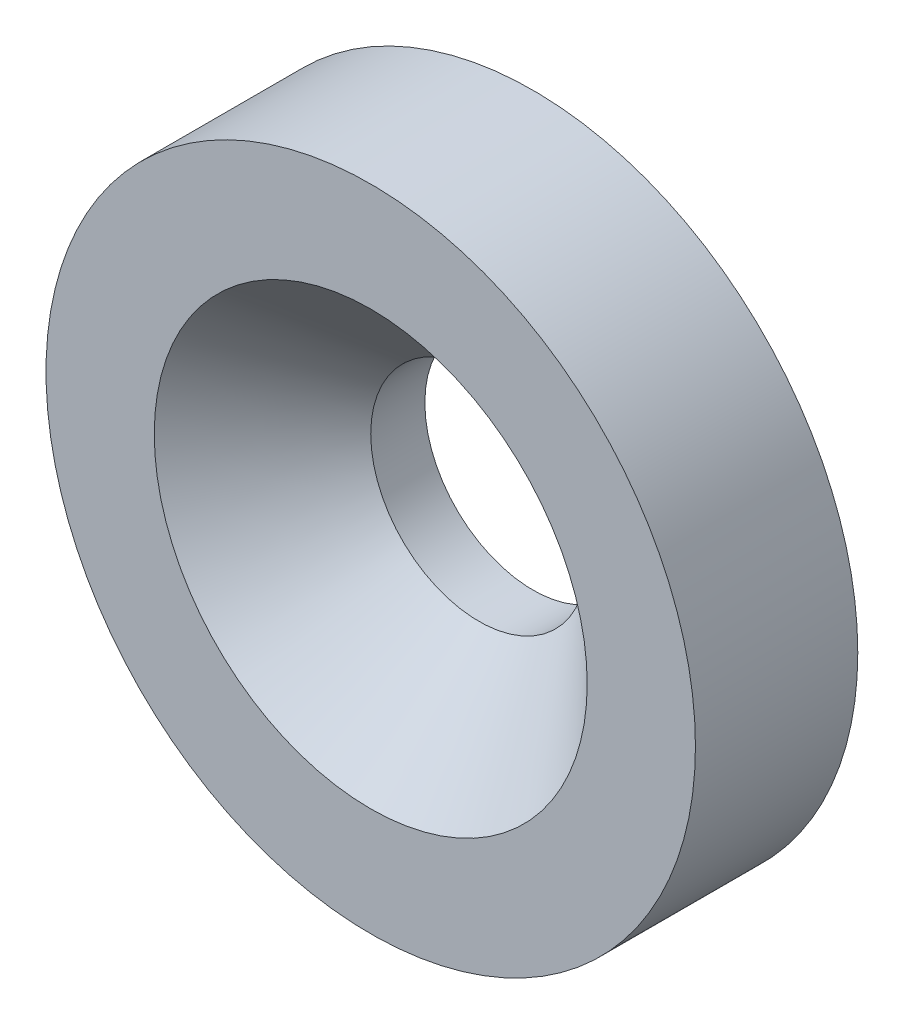
ISO-10303-21;
HEADER;
FILE_DESCRIPTION(('STEP AP214'),'2;1');
FILE_NAME('part.step','',(''),(''),'','','');
FILE_SCHEMA(('AUTOMOTIVE_DESIGN { 1 0 10303 214 1 1 1 1 }'));
ENDSEC;
DATA;
#1=APPLICATION_CONTEXT('core data for automotive mechanical design processes');
#2=APPLICATION_PROTOCOL_DEFINITION('international standard','automotive_design',2000,#1);
#3=PRODUCT_CONTEXT('',#1,'mechanical');
#4=PRODUCT('Part','Part','',(#3));
#5=PRODUCT_RELATED_PRODUCT_CATEGORY('part','',(#4));
#6=PRODUCT_DEFINITION_FORMATION('','',#4);
#7=PRODUCT_DEFINITION_CONTEXT('part definition',#1,'design');
#8=PRODUCT_DEFINITION('design','',#6,#7);
#9=PRODUCT_DEFINITION_SHAPE('','',#8);
#10=(LENGTH_UNIT() NAMED_UNIT(*) SI_UNIT(.MILLI.,.METRE.));
#11=(NAMED_UNIT(*) PLANE_ANGLE_UNIT() SI_UNIT($,.RADIAN.));
#12=(NAMED_UNIT(*) SI_UNIT($,.STERADIAN.) SOLID_ANGLE_UNIT());
#13=UNCERTAINTY_MEASURE_WITH_UNIT(LENGTH_MEASURE(1.E-05),#10,'distance_accuracy_value','');
#14=(GEOMETRIC_REPRESENTATION_CONTEXT(3) GLOBAL_UNCERTAINTY_ASSIGNED_CONTEXT((#13)) GLOBAL_UNIT_ASSIGNED_CONTEXT((#10,
#11,#12)) REPRESENTATION_CONTEXT('',''));
#15=CARTESIAN_POINT('',(0.,0.,0.));
#16=DIRECTION('',(0.,0.,1.));
#17=DIRECTION('',(1.,0.,0.));
#18=AXIS2_PLACEMENT_3D('',#15,#16,#17);
#19=CARTESIAN_POINT('',(0.,0.,3.));
#20=DIRECTION('',(0.,0.,-1.));
#21=DIRECTION('',(-1.,0.,0.));
#22=AXIS2_PLACEMENT_3D('',#19,#20,#21);
#23=CYLINDRICAL_SURFACE('',#22,6.);
#24=CARTESIAN_POINT('',(0.,0.,3.));
#25=DIRECTION('',(0.,0.,1.));
#26=DIRECTION('',(1.,0.,0.));
#27=AXIS2_PLACEMENT_3D('',#24,#25,#26);
#28=CIRCLE('',#27,6.);
#29=CARTESIAN_POINT('',(6.,0.,3.));
#30=VERTEX_POINT('',#29);
#31=EDGE_CURVE('E53',#30,#30,#28,.T.);
#32=ORIENTED_EDGE('',*,*,#31,.F.);
#33=EDGE_LOOP('',(#32));
#34=FACE_BOUND('',#33,.T.);
#35=CARTESIAN_POINT('',(0.,0.,0.));
#36=DIRECTION('',(0.,0.,1.));
#37=DIRECTION('',(1.,0.,0.));
#38=AXIS2_PLACEMENT_3D('',#35,#36,#37);
#39=CIRCLE('',#38,6.);
#40=CARTESIAN_POINT('',(6.,0.,0.));
#41=VERTEX_POINT('',#40);
#42=EDGE_CURVE('E58',#41,#41,#39,.T.);
#43=ORIENTED_EDGE('',*,*,#42,.T.);
#44=EDGE_LOOP('',(#43));
#45=FACE_BOUND('',#44,.T.);
#46=ADVANCED_FACE('F39',(#34,#45),#23,.T.);
#47=CARTESIAN_POINT('',(0.,0.,3.));
#48=DIRECTION('',(0.,0.,1.));
#49=DIRECTION('',(1.,0.,0.));
#50=AXIS2_PLACEMENT_3D('',#47,#48,#49);
#51=PLANE('',#50);
#52=CARTESIAN_POINT('',(0.,0.,3.));
#53=DIRECTION('',(0.,0.,1.));
#54=DIRECTION('',(1.,0.,0.));
#55=AXIS2_PLACEMENT_3D('',#52,#53,#54);
#56=CIRCLE('',#55,4.00000000000001);
#57=CARTESIAN_POINT('',(4.00000000000001,0.,3.));
#58=VERTEX_POINT('',#57);
#59=EDGE_CURVE('E10',#58,#58,#56,.F.);
#60=ORIENTED_EDGE('',*,*,#59,.T.);
#61=EDGE_LOOP('',(#60));
#62=FACE_BOUND('',#61,.T.);
#63=ORIENTED_EDGE('',*,*,#31,.T.);
#64=EDGE_LOOP('',(#63));
#65=FACE_BOUND('',#64,.T.);
#66=ADVANCED_FACE('F80',(#62,#65),#51,.T.);
#67=CARTESIAN_POINT('',(0.,0.,0.));
#68=DIRECTION('',(0.,0.,1.));
#69=DIRECTION('',(1.,0.,0.));
#70=AXIS2_PLACEMENT_3D('',#67,#68,#69);
#71=PLANE('',#70);
#72=CARTESIAN_POINT('',(0.,0.,0.));
#73=DIRECTION('',(0.,0.,1.));
#74=DIRECTION('',(1.,0.,0.));
#75=AXIS2_PLACEMENT_3D('',#72,#73,#74);
#76=CIRCLE('',#75,2.);
#77=CARTESIAN_POINT('',(2.,0.,0.));
#78=VERTEX_POINT('',#77);
#79=EDGE_CURVE('E63',#78,#78,#76,.T.);
#80=ORIENTED_EDGE('',*,*,#79,.T.);
#81=EDGE_LOOP('',(#80));
#82=FACE_BOUND('',#81,.T.);
#83=ORIENTED_EDGE('',*,*,#42,.F.);
#84=EDGE_LOOP('',(#83));
#85=FACE_BOUND('',#84,.T.);
#86=ADVANCED_FACE('F69',(#82,#85),#71,.F.);
#87=CARTESIAN_POINT('',(0.,0.,0.));
#88=DIRECTION('',(0.,0.,1.));
#89=DIRECTION('',(1.,0.,0.));
#90=AXIS2_PLACEMENT_3D('',#87,#88,#89);
#91=CYLINDRICAL_SURFACE('',#90,2.);
#92=CARTESIAN_POINT('',(0.,0.,1.));
#93=DIRECTION('',(0.,0.,1.));
#94=DIRECTION('',(1.,0.,0.));
#95=AXIS2_PLACEMENT_3D('',#92,#93,#94);
#96=CIRCLE('',#95,2.);
#97=CARTESIAN_POINT('',(2.,0.,1.));
#98=VERTEX_POINT('',#97);
#99=EDGE_CURVE('E48',#98,#98,#96,.T.);
#100=ORIENTED_EDGE('',*,*,#99,.T.);
#101=EDGE_LOOP('',(#100));
#102=FACE_BOUND('',#101,.T.);
#103=ORIENTED_EDGE('',*,*,#79,.F.);
#104=EDGE_LOOP('',(#103));
#105=FACE_BOUND('',#104,.T.);
#106=ADVANCED_FACE('F72',(#102,#105),#91,.F.);
#107=CARTESIAN_POINT('',(0.,0.,1.));
#108=DIRECTION('',(0.,0.,1.));
#109=DIRECTION('',(1.,0.,0.));
#110=AXIS2_PLACEMENT_3D('',#107,#108,#109);
#111=CONICAL_SURFACE('',#110,2.,0.785398163397451);
#112=ORIENTED_EDGE('',*,*,#59,.F.);
#113=EDGE_LOOP('',(#112));
#114=FACE_BOUND('',#113,.T.);
#115=ORIENTED_EDGE('',*,*,#99,.F.);
#116=EDGE_LOOP('',(#115));
#117=FACE_BOUND('',#116,.T.);
#118=ADVANCED_FACE('F42',(#114,#117),#111,.F.);
#119=CLOSED_SHELL('',(#46,#66,#86,#106,#118));
#120=MANIFOLD_SOLID_BREP('B2',#119);
#121=ADVANCED_BREP_SHAPE_REPRESENTATION('',(#18,#120),#14);
#122=SHAPE_DEFINITION_REPRESENTATION(#9,#121);
ENDSEC;
END-ISO-10303-21;
